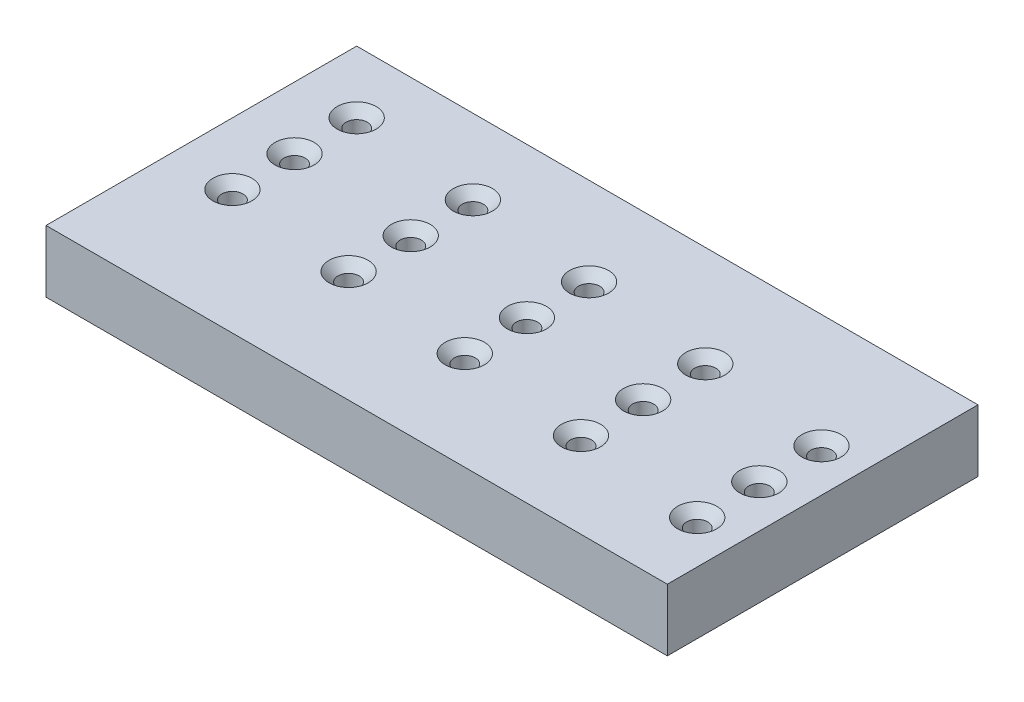
ISO-10303-21;
HEADER;
FILE_DESCRIPTION(('STEP AP214'),'2;1');
FILE_NAME('part.step','',(''),(''),'','','');
FILE_SCHEMA(('AUTOMOTIVE_DESIGN { 1 0 10303 214 1 1 1 1 }'));
ENDSEC;
DATA;
#1=APPLICATION_CONTEXT('core data for automotive mechanical design processes');
#2=APPLICATION_PROTOCOL_DEFINITION('international standard','automotive_design',2000,#1);
#3=PRODUCT_CONTEXT('',#1,'mechanical');
#4=PRODUCT('Part','Part','',(#3));
#5=PRODUCT_RELATED_PRODUCT_CATEGORY('part','',(#4));
#6=PRODUCT_DEFINITION_FORMATION('','',#4);
#7=PRODUCT_DEFINITION_CONTEXT('part definition',#1,'design');
#8=PRODUCT_DEFINITION('design','',#6,#7);
#9=PRODUCT_DEFINITION_SHAPE('','',#8);
#10=(LENGTH_UNIT() NAMED_UNIT(*) SI_UNIT(.MILLI.,.METRE.));
#11=(NAMED_UNIT(*) PLANE_ANGLE_UNIT() SI_UNIT($,.RADIAN.));
#12=(NAMED_UNIT(*) SI_UNIT($,.STERADIAN.) SOLID_ANGLE_UNIT());
#13=UNCERTAINTY_MEASURE_WITH_UNIT(LENGTH_MEASURE(1.E-05),#10,'distance_accuracy_value','');
#14=(GEOMETRIC_REPRESENTATION_CONTEXT(3) GLOBAL_UNCERTAINTY_ASSIGNED_CONTEXT((#13)) GLOBAL_UNIT_ASSIGNED_CONTEXT((#10,
#11,#12)) REPRESENTATION_CONTEXT('',''));
#15=CARTESIAN_POINT('',(0.,0.,0.));
#16=DIRECTION('',(0.,0.,1.));
#17=DIRECTION('',(1.,0.,0.));
#18=AXIS2_PLACEMENT_3D('',#15,#16,#17);
#19=CARTESIAN_POINT('',(-50.,10.,-25.));
#20=DIRECTION('',(1.,0.,0.));
#21=DIRECTION('',(0.,0.,-1.));
#22=AXIS2_PLACEMENT_3D('',#19,#20,#21);
#23=PLANE('',#22);
#24=DIRECTION('',(0.,0.,1.));
#25=VECTOR('',#24,1.);
#26=CARTESIAN_POINT('',(-50.,0.,-25.));
#27=LINE('',#26,#25);
#28=CARTESIAN_POINT('',(-50.,0.,-25.));
#29=VERTEX_POINT('',#28);
#30=CARTESIAN_POINT('',(-50.,0.,25.));
#31=VERTEX_POINT('',#30);
#32=EDGE_CURVE('E96',#29,#31,#27,.T.);
#33=ORIENTED_EDGE('',*,*,#32,.T.);
#34=DIRECTION('',(0.,-1.,0.));
#35=VECTOR('',#34,1.);
#36=CARTESIAN_POINT('',(-50.,10.,25.));
#37=LINE('',#36,#35);
#38=CARTESIAN_POINT('',(-50.,10.,25.));
#39=VERTEX_POINT('',#38);
#40=EDGE_CURVE('E11',#39,#31,#37,.T.);
#41=ORIENTED_EDGE('',*,*,#40,.F.);
#42=DIRECTION('',(0.,0.,1.));
#43=VECTOR('',#42,1.);
#44=CARTESIAN_POINT('',(-50.,10.,-25.));
#45=LINE('',#44,#43);
#46=CARTESIAN_POINT('',(-50.,10.,-25.));
#47=VERTEX_POINT('',#46);
#48=EDGE_CURVE('E84',#47,#39,#45,.T.);
#49=ORIENTED_EDGE('',*,*,#48,.F.);
#50=DIRECTION('',(0.,-1.,0.));
#51=VECTOR('',#50,1.);
#52=CARTESIAN_POINT('',(-50.,10.,-25.));
#53=LINE('',#52,#51);
#54=EDGE_CURVE('E92',#47,#29,#53,.T.);
#55=ORIENTED_EDGE('',*,*,#54,.T.);
#56=EDGE_LOOP('',(#33,#41,#49,#55));
#57=FACE_BOUND('',#56,.T.);
#58=ADVANCED_FACE('F33',(#57),#23,.F.);
#59=CARTESIAN_POINT('',(-50.,10.,25.));
#60=DIRECTION('',(0.,0.,-1.));
#61=DIRECTION('',(-1.,0.,0.));
#62=AXIS2_PLACEMENT_3D('',#59,#60,#61);
#63=PLANE('',#62);
#64=DIRECTION('',(1.,0.,0.));
#65=VECTOR('',#64,1.);
#66=CARTESIAN_POINT('',(-50.,0.,25.));
#67=LINE('',#66,#65);
#68=CARTESIAN_POINT('',(50.,0.,25.));
#69=VERTEX_POINT('',#68);
#70=EDGE_CURVE('E88',#31,#69,#67,.T.);
#71=ORIENTED_EDGE('',*,*,#70,.T.);
#72=DIRECTION('',(0.,-1.,0.));
#73=VECTOR('',#72,1.);
#74=CARTESIAN_POINT('',(50.,10.,25.));
#75=LINE('',#74,#73);
#76=CARTESIAN_POINT('',(50.,10.,25.));
#77=VERTEX_POINT('',#76);
#78=EDGE_CURVE('E41',#77,#69,#75,.T.);
#79=ORIENTED_EDGE('',*,*,#78,.F.);
#80=DIRECTION('',(1.,0.,0.));
#81=VECTOR('',#80,1.);
#82=CARTESIAN_POINT('',(-50.,10.,25.));
#83=LINE('',#82,#81);
#84=EDGE_CURVE('E79',#39,#77,#83,.T.);
#85=ORIENTED_EDGE('',*,*,#84,.F.);
#86=ORIENTED_EDGE('',*,*,#40,.T.);
#87=EDGE_LOOP('',(#71,#79,#85,#86));
#88=FACE_BOUND('',#87,.T.);
#89=ADVANCED_FACE('F87',(#88),#63,.F.);
#90=CARTESIAN_POINT('',(50.,10.,-25.));
#91=DIRECTION('',(-1.,0.,0.));
#92=DIRECTION('',(0.,0.,1.));
#93=AXIS2_PLACEMENT_3D('',#90,#91,#92);
#94=PLANE('',#93);
#95=DIRECTION('',(0.,0.,-1.));
#96=VECTOR('',#95,1.);
#97=CARTESIAN_POINT('',(50.,0.,-25.));
#98=LINE('',#97,#96);
#99=CARTESIAN_POINT('',(50.,0.,-25.));
#100=VERTEX_POINT('',#99);
#101=EDGE_CURVE('E66',#69,#100,#98,.T.);
#102=ORIENTED_EDGE('',*,*,#101,.T.);
#103=DIRECTION('',(0.,-1.,0.));
#104=VECTOR('',#103,1.);
#105=CARTESIAN_POINT('',(50.,10.,-25.));
#106=LINE('',#105,#104);
#107=CARTESIAN_POINT('',(50.,10.,-25.));
#108=VERTEX_POINT('',#107);
#109=EDGE_CURVE('E89',#108,#100,#106,.T.);
#110=ORIENTED_EDGE('',*,*,#109,.F.);
#111=DIRECTION('',(0.,0.,-1.));
#112=VECTOR('',#111,1.);
#113=CARTESIAN_POINT('',(50.,10.,-25.));
#114=LINE('',#113,#112);
#115=EDGE_CURVE('E82',#77,#108,#114,.T.);
#116=ORIENTED_EDGE('',*,*,#115,.F.);
#117=ORIENTED_EDGE('',*,*,#78,.T.);
#118=EDGE_LOOP('',(#102,#110,#116,#117));
#119=FACE_BOUND('',#118,.T.);
#120=ADVANCED_FACE('F90',(#119),#94,.F.);
#121=CARTESIAN_POINT('',(-50.,10.,-25.));
#122=DIRECTION('',(0.,0.,1.));
#123=DIRECTION('',(1.,0.,0.));
#124=AXIS2_PLACEMENT_3D('',#121,#122,#123);
#125=PLANE('',#124);
#126=DIRECTION('',(-1.,0.,0.));
#127=VECTOR('',#126,1.);
#128=CARTESIAN_POINT('',(-50.,0.,-25.));
#129=LINE('',#128,#127);
#130=EDGE_CURVE('E72',#100,#29,#129,.T.);
#131=ORIENTED_EDGE('',*,*,#130,.T.);
#132=ORIENTED_EDGE('',*,*,#54,.F.);
#133=DIRECTION('',(-1.,0.,0.));
#134=VECTOR('',#133,1.);
#135=CARTESIAN_POINT('',(-50.,10.,-25.));
#136=LINE('',#135,#134);
#137=EDGE_CURVE('E49',#108,#47,#136,.T.);
#138=ORIENTED_EDGE('',*,*,#137,.F.);
#139=ORIENTED_EDGE('',*,*,#109,.T.);
#140=EDGE_LOOP('',(#131,#132,#138,#139));
#141=FACE_BOUND('',#140,.T.);
#142=ADVANCED_FACE('F104',(#141),#125,.F.);
#143=CARTESIAN_POINT('',(0.,10.,0.));
#144=DIRECTION('',(0.,1.,0.));
#145=DIRECTION('',(0.,0.,1.));
#146=AXIS2_PLACEMENT_3D('',#143,#144,#145);
#147=PLANE('',#146);
#148=CARTESIAN_POINT('',(43.1189350285932,10.,13.3118935028593));
#149=DIRECTION('',(0.,1.,0.));
#150=DIRECTION('',(0.,0.,1.));
#151=AXIS2_PLACEMENT_3D('',#148,#149,#150);
#152=CIRCLE('',#151,3.15);
#153=CARTESIAN_POINT('',(43.1189350285932,10.,16.4618935028593));
#154=VERTEX_POINT('',#153);
#155=EDGE_CURVE('E241',#154,#154,#152,.T.);
#156=ORIENTED_EDGE('',*,*,#155,.F.);
#157=EDGE_LOOP('',(#156));
#158=FACE_BOUND('',#157,.T.);
#159=CARTESIAN_POINT('',(43.1189350285932,10.,3.31189350285933));
#160=DIRECTION('',(0.,1.,0.));
#161=DIRECTION('',(0.,0.,1.));
#162=AXIS2_PLACEMENT_3D('',#159,#160,#161);
#163=CIRCLE('',#162,3.15);
#164=CARTESIAN_POINT('',(43.1189350285932,10.,6.46189350285933));
#165=VERTEX_POINT('',#164);
#166=EDGE_CURVE('E232',#165,#165,#163,.T.);
#167=ORIENTED_EDGE('',*,*,#166,.F.);
#168=EDGE_LOOP('',(#167));
#169=FACE_BOUND('',#168,.T.);
#170=CARTESIAN_POINT('',(43.1189350285932,10.,-6.68810649714067));
#171=DIRECTION('',(0.,1.,0.));
#172=DIRECTION('',(0.,0.,1.));
#173=AXIS2_PLACEMENT_3D('',#170,#171,#172);
#174=CIRCLE('',#173,3.15);
#175=CARTESIAN_POINT('',(43.1189350285932,10.,-3.53810649714067));
#176=VERTEX_POINT('',#175);
#177=EDGE_CURVE('E223',#176,#176,#174,.T.);
#178=ORIENTED_EDGE('',*,*,#177,.F.);
#179=EDGE_LOOP('',(#178));
#180=FACE_BOUND('',#179,.T.);
#181=CARTESIAN_POINT('',(22.3392012714449,10.,11.2339201271445));
#182=DIRECTION('',(0.,1.,0.));
#183=DIRECTION('',(0.,0.,1.));
#184=AXIS2_PLACEMENT_3D('',#181,#182,#183);
#185=CIRCLE('',#184,3.15);
#186=CARTESIAN_POINT('',(22.3392012714449,10.,14.3839201271445));
#187=VERTEX_POINT('',#186);
#188=EDGE_CURVE('E214',#187,#187,#185,.T.);
#189=ORIENTED_EDGE('',*,*,#188,.F.);
#190=EDGE_LOOP('',(#189));
#191=FACE_BOUND('',#190,.T.);
#192=CARTESIAN_POINT('',(22.3392012714449,10.,1.2339201271445));
#193=DIRECTION('',(0.,1.,0.));
#194=DIRECTION('',(0.,0.,1.));
#195=AXIS2_PLACEMENT_3D('',#192,#193,#194);
#196=CIRCLE('',#195,3.15);
#197=CARTESIAN_POINT('',(22.3392012714449,10.,4.3839201271445));
#198=VERTEX_POINT('',#197);
#199=EDGE_CURVE('E205',#198,#198,#196,.T.);
#200=ORIENTED_EDGE('',*,*,#199,.F.);
#201=EDGE_LOOP('',(#200));
#202=FACE_BOUND('',#201,.T.);
#203=CARTESIAN_POINT('',(22.3392012714449,10.,-8.7660798728555));
#204=DIRECTION('',(0.,1.,0.));
#205=DIRECTION('',(0.,0.,1.));
#206=AXIS2_PLACEMENT_3D('',#203,#204,#205);
#207=CIRCLE('',#206,3.15);
#208=CARTESIAN_POINT('',(22.3392012714449,10.,-5.6160798728555));
#209=VERTEX_POINT('',#208);
#210=EDGE_CURVE('E196',#209,#209,#207,.T.);
#211=ORIENTED_EDGE('',*,*,#210,.F.);
#212=EDGE_LOOP('',(#211));
#213=FACE_BOUND('',#212,.T.);
#214=CARTESIAN_POINT('',(1.55946751429659,10.,9.15594675142967));
#215=DIRECTION('',(0.,1.,0.));
#216=DIRECTION('',(0.,0.,1.));
#217=AXIS2_PLACEMENT_3D('',#214,#215,#216);
#218=CIRCLE('',#217,3.15);
#219=CARTESIAN_POINT('',(1.55946751429659,10.,12.3059467514297));
#220=VERTEX_POINT('',#219);
#221=EDGE_CURVE('E187',#220,#220,#218,.T.);
#222=ORIENTED_EDGE('',*,*,#221,.F.);
#223=EDGE_LOOP('',(#222));
#224=FACE_BOUND('',#223,.T.);
#225=CARTESIAN_POINT('',(1.55946751429659,10.,-0.844053248570335));
#226=DIRECTION('',(0.,1.,0.));
#227=DIRECTION('',(0.,0.,1.));
#228=AXIS2_PLACEMENT_3D('',#225,#226,#227);
#229=CIRCLE('',#228,3.15);
#230=CARTESIAN_POINT('',(1.55946751429659,10.,2.30594675142966));
#231=VERTEX_POINT('',#230);
#232=EDGE_CURVE('E178',#231,#231,#229,.T.);
#233=ORIENTED_EDGE('',*,*,#232,.F.);
#234=EDGE_LOOP('',(#233));
#235=FACE_BOUND('',#234,.T.);
#236=CARTESIAN_POINT('',(1.55946751429659,10.,-10.8440532485703));
#237=DIRECTION('',(0.,1.,0.));
#238=DIRECTION('',(0.,0.,1.));
#239=AXIS2_PLACEMENT_3D('',#236,#237,#238);
#240=CIRCLE('',#239,3.15);
#241=CARTESIAN_POINT('',(1.55946751429659,10.,-7.69405324857033));
#242=VERTEX_POINT('',#241);
#243=EDGE_CURVE('E169',#242,#242,#240,.T.);
#244=ORIENTED_EDGE('',*,*,#243,.F.);
#245=EDGE_LOOP('',(#244));
#246=FACE_BOUND('',#245,.T.);
#247=CARTESIAN_POINT('',(-19.2202662428517,10.,7.07797337571484));
#248=DIRECTION('',(0.,1.,0.));
#249=DIRECTION('',(0.,0.,1.));
#250=AXIS2_PLACEMENT_3D('',#247,#248,#249);
#251=CIRCLE('',#250,3.15);
#252=CARTESIAN_POINT('',(-19.2202662428517,10.,10.2279733757148));
#253=VERTEX_POINT('',#252);
#254=EDGE_CURVE('E160',#253,#253,#251,.T.);
#255=ORIENTED_EDGE('',*,*,#254,.F.);
#256=EDGE_LOOP('',(#255));
#257=FACE_BOUND('',#256,.T.);
#258=CARTESIAN_POINT('',(-19.2202662428517,10.,-2.92202662428516));
#259=DIRECTION('',(0.,1.,0.));
#260=DIRECTION('',(0.,0.,1.));
#261=AXIS2_PLACEMENT_3D('',#258,#259,#260);
#262=CIRCLE('',#261,3.15);
#263=CARTESIAN_POINT('',(-19.2202662428517,10.,0.227973375714835));
#264=VERTEX_POINT('',#263);
#265=EDGE_CURVE('E151',#264,#264,#262,.T.);
#266=ORIENTED_EDGE('',*,*,#265,.F.);
#267=EDGE_LOOP('',(#266));
#268=FACE_BOUND('',#267,.T.);
#269=CARTESIAN_POINT('',(-19.2202662428517,10.,-12.9220266242852));
#270=DIRECTION('',(0.,1.,0.));
#271=DIRECTION('',(0.,0.,1.));
#272=AXIS2_PLACEMENT_3D('',#269,#270,#271);
#273=CIRCLE('',#272,3.15);
#274=CARTESIAN_POINT('',(-19.2202662428517,10.,-9.77202662428516));
#275=VERTEX_POINT('',#274);
#276=EDGE_CURVE('E142',#275,#275,#273,.T.);
#277=ORIENTED_EDGE('',*,*,#276,.F.);
#278=EDGE_LOOP('',(#277));
#279=FACE_BOUND('',#278,.T.);
#280=CARTESIAN_POINT('',(-40.,10.,5.));
#281=DIRECTION('',(0.,1.,0.));
#282=DIRECTION('',(0.,0.,1.));
#283=AXIS2_PLACEMENT_3D('',#280,#281,#282);
#284=CIRCLE('',#283,3.15);
#285=CARTESIAN_POINT('',(-40.,10.,8.15));
#286=VERTEX_POINT('',#285);
#287=EDGE_CURVE('E133',#286,#286,#284,.T.);
#288=ORIENTED_EDGE('',*,*,#287,.F.);
#289=EDGE_LOOP('',(#288));
#290=FACE_BOUND('',#289,.T.);
#291=CARTESIAN_POINT('',(-40.,10.,-5.));
#292=DIRECTION('',(0.,1.,0.));
#293=DIRECTION('',(0.,0.,1.));
#294=AXIS2_PLACEMENT_3D('',#291,#292,#293);
#295=CIRCLE('',#294,3.15);
#296=CARTESIAN_POINT('',(-40.,10.,-1.85));
#297=VERTEX_POINT('',#296);
#298=EDGE_CURVE('E124',#297,#297,#295,.T.);
#299=ORIENTED_EDGE('',*,*,#298,.F.);
#300=EDGE_LOOP('',(#299));
#301=FACE_BOUND('',#300,.T.);
#302=CARTESIAN_POINT('',(-40.,10.,-15.));
#303=DIRECTION('',(0.,1.,0.));
#304=DIRECTION('',(0.,0.,1.));
#305=AXIS2_PLACEMENT_3D('',#302,#303,#304);
#306=CIRCLE('',#305,3.15);
#307=CARTESIAN_POINT('',(-40.,10.,-11.85));
#308=VERTEX_POINT('',#307);
#309=EDGE_CURVE('E115',#308,#308,#306,.T.);
#310=ORIENTED_EDGE('',*,*,#309,.F.);
#311=EDGE_LOOP('',(#310));
#312=FACE_BOUND('',#311,.T.);
#313=ORIENTED_EDGE('',*,*,#48,.T.);
#314=ORIENTED_EDGE('',*,*,#84,.T.);
#315=ORIENTED_EDGE('',*,*,#115,.T.);
#316=ORIENTED_EDGE('',*,*,#137,.T.);
#317=EDGE_LOOP('',(#313,#314,#315,#316));
#318=FACE_BOUND('',#317,.T.);
#319=ADVANCED_FACE('F80',(#158,#169,#180,#191,#202,#213,#224,#235,#246,#257,#268,#279,#290,#301,
#312,#318),#147,.T.);
#320=CARTESIAN_POINT('',(0.,0.,0.));
#321=DIRECTION('',(0.,1.,0.));
#322=DIRECTION('',(0.,0.,1.));
#323=AXIS2_PLACEMENT_3D('',#320,#321,#322);
#324=PLANE('',#323);
#325=CARTESIAN_POINT('',(43.1189350285932,0.,13.3118935028593));
#326=DIRECTION('',(0.,1.,0.));
#327=DIRECTION('',(0.,0.,1.));
#328=AXIS2_PLACEMENT_3D('',#325,#326,#327);
#329=CIRCLE('',#328,1.7);
#330=CARTESIAN_POINT('',(43.1189350285932,0.,15.0118935028593));
#331=VERTEX_POINT('',#330);
#332=EDGE_CURVE('E235',#331,#331,#329,.T.);
#333=ORIENTED_EDGE('',*,*,#332,.T.);
#334=EDGE_LOOP('',(#333));
#335=FACE_BOUND('',#334,.T.);
#336=CARTESIAN_POINT('',(43.1189350285932,0.,3.31189350285933));
#337=DIRECTION('',(0.,1.,0.));
#338=DIRECTION('',(0.,0.,1.));
#339=AXIS2_PLACEMENT_3D('',#336,#337,#338);
#340=CIRCLE('',#339,1.7);
#341=CARTESIAN_POINT('',(43.1189350285932,0.,5.01189350285933));
#342=VERTEX_POINT('',#341);
#343=EDGE_CURVE('E226',#342,#342,#340,.T.);
#344=ORIENTED_EDGE('',*,*,#343,.T.);
#345=EDGE_LOOP('',(#344));
#346=FACE_BOUND('',#345,.T.);
#347=CARTESIAN_POINT('',(43.1189350285932,0.,-6.68810649714067));
#348=DIRECTION('',(0.,1.,0.));
#349=DIRECTION('',(0.,0.,1.));
#350=AXIS2_PLACEMENT_3D('',#347,#348,#349);
#351=CIRCLE('',#350,1.7);
#352=CARTESIAN_POINT('',(43.1189350285932,0.,-4.98810649714067));
#353=VERTEX_POINT('',#352);
#354=EDGE_CURVE('E217',#353,#353,#351,.T.);
#355=ORIENTED_EDGE('',*,*,#354,.T.);
#356=EDGE_LOOP('',(#355));
#357=FACE_BOUND('',#356,.T.);
#358=CARTESIAN_POINT('',(22.3392012714449,0.,11.2339201271445));
#359=DIRECTION('',(0.,1.,0.));
#360=DIRECTION('',(0.,0.,1.));
#361=AXIS2_PLACEMENT_3D('',#358,#359,#360);
#362=CIRCLE('',#361,1.7);
#363=CARTESIAN_POINT('',(22.3392012714449,0.,12.9339201271445));
#364=VERTEX_POINT('',#363);
#365=EDGE_CURVE('E208',#364,#364,#362,.T.);
#366=ORIENTED_EDGE('',*,*,#365,.T.);
#367=EDGE_LOOP('',(#366));
#368=FACE_BOUND('',#367,.T.);
#369=CARTESIAN_POINT('',(22.3392012714449,0.,1.2339201271445));
#370=DIRECTION('',(0.,1.,0.));
#371=DIRECTION('',(0.,0.,1.));
#372=AXIS2_PLACEMENT_3D('',#369,#370,#371);
#373=CIRCLE('',#372,1.7);
#374=CARTESIAN_POINT('',(22.3392012714449,0.,2.93392012714449));
#375=VERTEX_POINT('',#374);
#376=EDGE_CURVE('E199',#375,#375,#373,.T.);
#377=ORIENTED_EDGE('',*,*,#376,.T.);
#378=EDGE_LOOP('',(#377));
#379=FACE_BOUND('',#378,.T.);
#380=CARTESIAN_POINT('',(22.3392012714449,0.,-8.7660798728555));
#381=DIRECTION('',(0.,1.,0.));
#382=DIRECTION('',(0.,0.,1.));
#383=AXIS2_PLACEMENT_3D('',#380,#381,#382);
#384=CIRCLE('',#383,1.7);
#385=CARTESIAN_POINT('',(22.3392012714449,0.,-7.06607987285551));
#386=VERTEX_POINT('',#385);
#387=EDGE_CURVE('E190',#386,#386,#384,.T.);
#388=ORIENTED_EDGE('',*,*,#387,.T.);
#389=EDGE_LOOP('',(#388));
#390=FACE_BOUND('',#389,.T.);
#391=CARTESIAN_POINT('',(1.55946751429659,0.,9.15594675142967));
#392=DIRECTION('',(0.,1.,0.));
#393=DIRECTION('',(0.,0.,1.));
#394=AXIS2_PLACEMENT_3D('',#391,#392,#393);
#395=CIRCLE('',#394,1.7);
#396=CARTESIAN_POINT('',(1.55946751429659,0.,10.8559467514297));
#397=VERTEX_POINT('',#396);
#398=EDGE_CURVE('E181',#397,#397,#395,.T.);
#399=ORIENTED_EDGE('',*,*,#398,.T.);
#400=EDGE_LOOP('',(#399));
#401=FACE_BOUND('',#400,.T.);
#402=CARTESIAN_POINT('',(1.55946751429659,0.,-0.844053248570335));
#403=DIRECTION('',(0.,1.,0.));
#404=DIRECTION('',(0.,0.,1.));
#405=AXIS2_PLACEMENT_3D('',#402,#403,#404);
#406=CIRCLE('',#405,1.7);
#407=CARTESIAN_POINT('',(1.55946751429659,0.,0.855946751429662));
#408=VERTEX_POINT('',#407);
#409=EDGE_CURVE('E172',#408,#408,#406,.T.);
#410=ORIENTED_EDGE('',*,*,#409,.T.);
#411=EDGE_LOOP('',(#410));
#412=FACE_BOUND('',#411,.T.);
#413=CARTESIAN_POINT('',(1.55946751429659,0.,-10.8440532485703));
#414=DIRECTION('',(0.,1.,0.));
#415=DIRECTION('',(0.,0.,1.));
#416=AXIS2_PLACEMENT_3D('',#413,#414,#415);
#417=CIRCLE('',#416,1.7);
#418=CARTESIAN_POINT('',(1.55946751429659,0.,-9.14405324857034));
#419=VERTEX_POINT('',#418);
#420=EDGE_CURVE('E163',#419,#419,#417,.T.);
#421=ORIENTED_EDGE('',*,*,#420,.T.);
#422=EDGE_LOOP('',(#421));
#423=FACE_BOUND('',#422,.T.);
#424=CARTESIAN_POINT('',(-19.2202662428517,0.,7.07797337571484));
#425=DIRECTION('',(0.,1.,0.));
#426=DIRECTION('',(0.,0.,1.));
#427=AXIS2_PLACEMENT_3D('',#424,#425,#426);
#428=CIRCLE('',#427,1.7);
#429=CARTESIAN_POINT('',(-19.2202662428517,0.,8.77797337571483));
#430=VERTEX_POINT('',#429);
#431=EDGE_CURVE('E154',#430,#430,#428,.T.);
#432=ORIENTED_EDGE('',*,*,#431,.T.);
#433=EDGE_LOOP('',(#432));
#434=FACE_BOUND('',#433,.T.);
#435=CARTESIAN_POINT('',(-19.2202662428517,0.,-2.92202662428516));
#436=DIRECTION('',(0.,1.,0.));
#437=DIRECTION('',(0.,0.,1.));
#438=AXIS2_PLACEMENT_3D('',#435,#436,#437);
#439=CIRCLE('',#438,1.7);
#440=CARTESIAN_POINT('',(-19.2202662428517,0.,-1.22202662428517));
#441=VERTEX_POINT('',#440);
#442=EDGE_CURVE('E145',#441,#441,#439,.T.);
#443=ORIENTED_EDGE('',*,*,#442,.T.);
#444=EDGE_LOOP('',(#443));
#445=FACE_BOUND('',#444,.T.);
#446=CARTESIAN_POINT('',(-19.2202662428517,0.,-12.9220266242852));
#447=DIRECTION('',(0.,1.,0.));
#448=DIRECTION('',(0.,0.,1.));
#449=AXIS2_PLACEMENT_3D('',#446,#447,#448);
#450=CIRCLE('',#449,1.7);
#451=CARTESIAN_POINT('',(-19.2202662428517,0.,-11.2220266242852));
#452=VERTEX_POINT('',#451);
#453=EDGE_CURVE('E136',#452,#452,#450,.T.);
#454=ORIENTED_EDGE('',*,*,#453,.T.);
#455=EDGE_LOOP('',(#454));
#456=FACE_BOUND('',#455,.T.);
#457=CARTESIAN_POINT('',(-40.,0.,5.));
#458=DIRECTION('',(0.,1.,0.));
#459=DIRECTION('',(0.,0.,1.));
#460=AXIS2_PLACEMENT_3D('',#457,#458,#459);
#461=CIRCLE('',#460,1.7);
#462=CARTESIAN_POINT('',(-40.,0.,6.7));
#463=VERTEX_POINT('',#462);
#464=EDGE_CURVE('E127',#463,#463,#461,.T.);
#465=ORIENTED_EDGE('',*,*,#464,.T.);
#466=EDGE_LOOP('',(#465));
#467=FACE_BOUND('',#466,.T.);
#468=CARTESIAN_POINT('',(-40.,0.,-5.));
#469=DIRECTION('',(0.,1.,0.));
#470=DIRECTION('',(0.,0.,1.));
#471=AXIS2_PLACEMENT_3D('',#468,#469,#470);
#472=CIRCLE('',#471,1.7);
#473=CARTESIAN_POINT('',(-40.,0.,-3.3));
#474=VERTEX_POINT('',#473);
#475=EDGE_CURVE('E118',#474,#474,#472,.T.);
#476=ORIENTED_EDGE('',*,*,#475,.T.);
#477=EDGE_LOOP('',(#476));
#478=FACE_BOUND('',#477,.T.);
#479=CARTESIAN_POINT('',(-40.,0.,-15.));
#480=DIRECTION('',(0.,1.,0.));
#481=DIRECTION('',(0.,0.,1.));
#482=AXIS2_PLACEMENT_3D('',#479,#480,#481);
#483=CIRCLE('',#482,1.7);
#484=CARTESIAN_POINT('',(-40.,0.,-13.3));
#485=VERTEX_POINT('',#484);
#486=EDGE_CURVE('E99',#485,#485,#483,.T.);
#487=ORIENTED_EDGE('',*,*,#486,.T.);
#488=EDGE_LOOP('',(#487));
#489=FACE_BOUND('',#488,.T.);
#490=ORIENTED_EDGE('',*,*,#32,.F.);
#491=ORIENTED_EDGE('',*,*,#130,.F.);
#492=ORIENTED_EDGE('',*,*,#101,.F.);
#493=ORIENTED_EDGE('',*,*,#70,.F.);
#494=EDGE_LOOP('',(#490,#491,#492,#493));
#495=FACE_BOUND('',#494,.T.);
#496=ADVANCED_FACE('F107',(#335,#346,#357,#368,#379,#390,#401,#412,#423,#434,#445,#456,#467,
#478,#489,#495),#324,.F.);
#497=CARTESIAN_POINT('',(-40.,10.,-15.));
#498=DIRECTION('',(0.,1.,0.));
#499=DIRECTION('',(0.,0.,1.));
#500=AXIS2_PLACEMENT_3D('',#497,#498,#499);
#501=CYLINDRICAL_SURFACE('',#500,1.7);
#502=ORIENTED_EDGE('',*,*,#486,.F.);
#503=EDGE_LOOP('',(#502));
#504=FACE_BOUND('',#503,.T.);
#505=CARTESIAN_POINT('',(-40.,8.55,-15.));
#506=DIRECTION('',(0.,1.,0.));
#507=DIRECTION('',(0.,0.,1.));
#508=AXIS2_PLACEMENT_3D('',#505,#506,#507);
#509=CIRCLE('',#508,1.7);
#510=CARTESIAN_POINT('',(-40.,8.55,-13.3));
#511=VERTEX_POINT('',#510);
#512=EDGE_CURVE('E112',#511,#511,#509,.T.);
#513=ORIENTED_EDGE('',*,*,#512,.T.);
#514=EDGE_LOOP('',(#513));
#515=FACE_BOUND('',#514,.T.);
#516=ADVANCED_FACE('F281',(#504,#515),#501,.F.);
#517=CARTESIAN_POINT('',(-40.,10.,-15.));
#518=DIRECTION('',(0.,1.,0.));
#519=DIRECTION('',(0.,0.,1.));
#520=AXIS2_PLACEMENT_3D('',#517,#518,#519);
#521=CONICAL_SURFACE('',#520,3.15,0.785398163397448);
#522=ORIENTED_EDGE('',*,*,#512,.F.);
#523=EDGE_LOOP('',(#522));
#524=FACE_BOUND('',#523,.T.);
#525=ORIENTED_EDGE('',*,*,#309,.T.);
#526=EDGE_LOOP('',(#525));
#527=FACE_BOUND('',#526,.T.);
#528=ADVANCED_FACE('F278',(#524,#527),#521,.F.);
#529=CARTESIAN_POINT('',(-40.,10.,-5.));
#530=DIRECTION('',(0.,1.,0.));
#531=DIRECTION('',(0.,0.,1.));
#532=AXIS2_PLACEMENT_3D('',#529,#530,#531);
#533=CYLINDRICAL_SURFACE('',#532,1.7);
#534=ORIENTED_EDGE('',*,*,#475,.F.);
#535=EDGE_LOOP('',(#534));
#536=FACE_BOUND('',#535,.T.);
#537=CARTESIAN_POINT('',(-40.,8.55,-5.));
#538=DIRECTION('',(0.,1.,0.));
#539=DIRECTION('',(0.,0.,1.));
#540=AXIS2_PLACEMENT_3D('',#537,#538,#539);
#541=CIRCLE('',#540,1.7);
#542=CARTESIAN_POINT('',(-40.,8.55,-3.3));
#543=VERTEX_POINT('',#542);
#544=EDGE_CURVE('E121',#543,#543,#541,.T.);
#545=ORIENTED_EDGE('',*,*,#544,.T.);
#546=EDGE_LOOP('',(#545));
#547=FACE_BOUND('',#546,.T.);
#548=ADVANCED_FACE('F280',(#536,#547),#533,.F.);
#549=CARTESIAN_POINT('',(-40.,10.,-5.));
#550=DIRECTION('',(0.,1.,0.));
#551=DIRECTION('',(0.,0.,1.));
#552=AXIS2_PLACEMENT_3D('',#549,#550,#551);
#553=CONICAL_SURFACE('',#552,3.15,0.785398163397448);
#554=ORIENTED_EDGE('',*,*,#544,.F.);
#555=EDGE_LOOP('',(#554));
#556=FACE_BOUND('',#555,.T.);
#557=ORIENTED_EDGE('',*,*,#298,.T.);
#558=EDGE_LOOP('',(#557));
#559=FACE_BOUND('',#558,.T.);
#560=ADVANCED_FACE('F288',(#556,#559),#553,.F.);
#561=CARTESIAN_POINT('',(-40.,10.,5.));
#562=DIRECTION('',(0.,1.,0.));
#563=DIRECTION('',(0.,0.,1.));
#564=AXIS2_PLACEMENT_3D('',#561,#562,#563);
#565=CYLINDRICAL_SURFACE('',#564,1.7);
#566=ORIENTED_EDGE('',*,*,#464,.F.);
#567=EDGE_LOOP('',(#566));
#568=FACE_BOUND('',#567,.T.);
#569=CARTESIAN_POINT('',(-40.,8.55,5.));
#570=DIRECTION('',(0.,1.,0.));
#571=DIRECTION('',(0.,0.,1.));
#572=AXIS2_PLACEMENT_3D('',#569,#570,#571);
#573=CIRCLE('',#572,1.7);
#574=CARTESIAN_POINT('',(-40.,8.55,6.7));
#575=VERTEX_POINT('',#574);
#576=EDGE_CURVE('E130',#575,#575,#573,.T.);
#577=ORIENTED_EDGE('',*,*,#576,.T.);
#578=EDGE_LOOP('',(#577));
#579=FACE_BOUND('',#578,.T.);
#580=ADVANCED_FACE('F344',(#568,#579),#565,.F.);
#581=CARTESIAN_POINT('',(-40.,10.,5.));
#582=DIRECTION('',(0.,1.,0.));
#583=DIRECTION('',(0.,0.,1.));
#584=AXIS2_PLACEMENT_3D('',#581,#582,#583);
#585=CONICAL_SURFACE('',#584,3.15,0.785398163397448);
#586=ORIENTED_EDGE('',*,*,#576,.F.);
#587=EDGE_LOOP('',(#586));
#588=FACE_BOUND('',#587,.T.);
#589=ORIENTED_EDGE('',*,*,#287,.T.);
#590=EDGE_LOOP('',(#589));
#591=FACE_BOUND('',#590,.T.);
#592=ADVANCED_FACE('F349',(#588,#591),#585,.F.);
#593=CARTESIAN_POINT('',(-19.2202662428517,10.,-12.9220266242852));
#594=DIRECTION('',(0.,1.,0.));
#595=DIRECTION('',(0.,0.,1.));
#596=AXIS2_PLACEMENT_3D('',#593,#594,#595);
#597=CYLINDRICAL_SURFACE('',#596,1.7);
#598=ORIENTED_EDGE('',*,*,#453,.F.);
#599=EDGE_LOOP('',(#598));
#600=FACE_BOUND('',#599,.T.);
#601=CARTESIAN_POINT('',(-19.2202662428517,8.55,-12.9220266242852));
#602=DIRECTION('',(0.,1.,0.));
#603=DIRECTION('',(0.,0.,1.));
#604=AXIS2_PLACEMENT_3D('',#601,#602,#603);
#605=CIRCLE('',#604,1.7);
#606=CARTESIAN_POINT('',(-19.2202662428517,8.55,-11.2220266242852));
#607=VERTEX_POINT('',#606);
#608=EDGE_CURVE('E139',#607,#607,#605,.T.);
#609=ORIENTED_EDGE('',*,*,#608,.T.);
#610=EDGE_LOOP('',(#609));
#611=FACE_BOUND('',#610,.T.);
#612=ADVANCED_FACE('F355',(#600,#611),#597,.F.);
#613=CARTESIAN_POINT('',(-19.2202662428517,10.,-12.9220266242852));
#614=DIRECTION('',(0.,1.,0.));
#615=DIRECTION('',(0.,0.,1.));
#616=AXIS2_PLACEMENT_3D('',#613,#614,#615);
#617=CONICAL_SURFACE('',#616,3.15,0.785398163397449);
#618=ORIENTED_EDGE('',*,*,#608,.F.);
#619=EDGE_LOOP('',(#618));
#620=FACE_BOUND('',#619,.T.);
#621=ORIENTED_EDGE('',*,*,#276,.T.);
#622=EDGE_LOOP('',(#621));
#623=FACE_BOUND('',#622,.T.);
#624=ADVANCED_FACE('F359',(#620,#623),#617,.F.);
#625=CARTESIAN_POINT('',(-19.2202662428517,10.,-2.92202662428516));
#626=DIRECTION('',(0.,1.,0.));
#627=DIRECTION('',(0.,0.,1.));
#628=AXIS2_PLACEMENT_3D('',#625,#626,#627);
#629=CYLINDRICAL_SURFACE('',#628,1.7);
#630=ORIENTED_EDGE('',*,*,#442,.F.);
#631=EDGE_LOOP('',(#630));
#632=FACE_BOUND('',#631,.T.);
#633=CARTESIAN_POINT('',(-19.2202662428517,8.55,-2.92202662428516));
#634=DIRECTION('',(0.,1.,0.));
#635=DIRECTION('',(0.,0.,1.));
#636=AXIS2_PLACEMENT_3D('',#633,#634,#635);
#637=CIRCLE('',#636,1.7);
#638=CARTESIAN_POINT('',(-19.2202662428517,8.55,-1.22202662428517));
#639=VERTEX_POINT('',#638);
#640=EDGE_CURVE('E148',#639,#639,#637,.T.);
#641=ORIENTED_EDGE('',*,*,#640,.T.);
#642=EDGE_LOOP('',(#641));
#643=FACE_BOUND('',#642,.T.);
#644=ADVANCED_FACE('F363',(#632,#643),#629,.F.);
#645=CARTESIAN_POINT('',(-19.2202662428517,10.,-2.92202662428516));
#646=DIRECTION('',(0.,1.,0.));
#647=DIRECTION('',(0.,0.,1.));
#648=AXIS2_PLACEMENT_3D('',#645,#646,#647);
#649=CONICAL_SURFACE('',#648,3.15,0.785398163397449);
#650=ORIENTED_EDGE('',*,*,#640,.F.);
#651=EDGE_LOOP('',(#650));
#652=FACE_BOUND('',#651,.T.);
#653=ORIENTED_EDGE('',*,*,#265,.T.);
#654=EDGE_LOOP('',(#653));
#655=FACE_BOUND('',#654,.T.);
#656=ADVANCED_FACE('F367',(#652,#655),#649,.F.);
#657=CARTESIAN_POINT('',(-19.2202662428517,10.,7.07797337571484));
#658=DIRECTION('',(0.,1.,0.));
#659=DIRECTION('',(0.,0.,1.));
#660=AXIS2_PLACEMENT_3D('',#657,#658,#659);
#661=CYLINDRICAL_SURFACE('',#660,1.7);
#662=ORIENTED_EDGE('',*,*,#431,.F.);
#663=EDGE_LOOP('',(#662));
#664=FACE_BOUND('',#663,.T.);
#665=CARTESIAN_POINT('',(-19.2202662428517,8.55,7.07797337571484));
#666=DIRECTION('',(0.,1.,0.));
#667=DIRECTION('',(0.,0.,1.));
#668=AXIS2_PLACEMENT_3D('',#665,#666,#667);
#669=CIRCLE('',#668,1.7);
#670=CARTESIAN_POINT('',(-19.2202662428517,8.55,8.77797337571483));
#671=VERTEX_POINT('',#670);
#672=EDGE_CURVE('E157',#671,#671,#669,.T.);
#673=ORIENTED_EDGE('',*,*,#672,.T.);
#674=EDGE_LOOP('',(#673));
#675=FACE_BOUND('',#674,.T.);
#676=ADVANCED_FACE('F371',(#664,#675),#661,.F.);
#677=CARTESIAN_POINT('',(-19.2202662428517,10.,7.07797337571484));
#678=DIRECTION('',(0.,1.,0.));
#679=DIRECTION('',(0.,0.,1.));
#680=AXIS2_PLACEMENT_3D('',#677,#678,#679);
#681=CONICAL_SURFACE('',#680,3.15,0.785398163397449);
#682=ORIENTED_EDGE('',*,*,#672,.F.);
#683=EDGE_LOOP('',(#682));
#684=FACE_BOUND('',#683,.T.);
#685=ORIENTED_EDGE('',*,*,#254,.T.);
#686=EDGE_LOOP('',(#685));
#687=FACE_BOUND('',#686,.T.);
#688=ADVANCED_FACE('F375',(#684,#687),#681,.F.);
#689=CARTESIAN_POINT('',(1.55946751429659,10.,-10.8440532485703));
#690=DIRECTION('',(0.,1.,0.));
#691=DIRECTION('',(0.,0.,1.));
#692=AXIS2_PLACEMENT_3D('',#689,#690,#691);
#693=CYLINDRICAL_SURFACE('',#692,1.7);
#694=ORIENTED_EDGE('',*,*,#420,.F.);
#695=EDGE_LOOP('',(#694));
#696=FACE_BOUND('',#695,.T.);
#697=CARTESIAN_POINT('',(1.55946751429659,8.55,-10.8440532485703));
#698=DIRECTION('',(0.,1.,0.));
#699=DIRECTION('',(0.,0.,1.));
#700=AXIS2_PLACEMENT_3D('',#697,#698,#699);
#701=CIRCLE('',#700,1.7);
#702=CARTESIAN_POINT('',(1.55946751429659,8.55,-9.14405324857034));
#703=VERTEX_POINT('',#702);
#704=EDGE_CURVE('E166',#703,#703,#701,.T.);
#705=ORIENTED_EDGE('',*,*,#704,.T.);
#706=EDGE_LOOP('',(#705));
#707=FACE_BOUND('',#706,.T.);
#708=ADVANCED_FACE('F379',(#696,#707),#693,.F.);
#709=CARTESIAN_POINT('',(1.55946751429659,10.,-10.8440532485703));
#710=DIRECTION('',(0.,1.,0.));
#711=DIRECTION('',(0.,0.,1.));
#712=AXIS2_PLACEMENT_3D('',#709,#710,#711);
#713=CONICAL_SURFACE('',#712,3.15,0.785398163397448);
#714=ORIENTED_EDGE('',*,*,#704,.F.);
#715=EDGE_LOOP('',(#714));
#716=FACE_BOUND('',#715,.T.);
#717=ORIENTED_EDGE('',*,*,#243,.T.);
#718=EDGE_LOOP('',(#717));
#719=FACE_BOUND('',#718,.T.);
#720=ADVANCED_FACE('F383',(#716,#719),#713,.F.);
#721=CARTESIAN_POINT('',(1.55946751429659,10.,-0.844053248570335));
#722=DIRECTION('',(0.,1.,0.));
#723=DIRECTION('',(0.,0.,1.));
#724=AXIS2_PLACEMENT_3D('',#721,#722,#723);
#725=CYLINDRICAL_SURFACE('',#724,1.7);
#726=ORIENTED_EDGE('',*,*,#409,.F.);
#727=EDGE_LOOP('',(#726));
#728=FACE_BOUND('',#727,.T.);
#729=CARTESIAN_POINT('',(1.55946751429659,8.55,-0.844053248570335));
#730=DIRECTION('',(0.,1.,0.));
#731=DIRECTION('',(0.,0.,1.));
#732=AXIS2_PLACEMENT_3D('',#729,#730,#731);
#733=CIRCLE('',#732,1.7);
#734=CARTESIAN_POINT('',(1.55946751429659,8.55,0.855946751429663));
#735=VERTEX_POINT('',#734);
#736=EDGE_CURVE('E175',#735,#735,#733,.T.);
#737=ORIENTED_EDGE('',*,*,#736,.T.);
#738=EDGE_LOOP('',(#737));
#739=FACE_BOUND('',#738,.T.);
#740=ADVANCED_FACE('F387',(#728,#739),#725,.F.);
#741=CARTESIAN_POINT('',(1.55946751429659,10.,-0.844053248570335));
#742=DIRECTION('',(0.,1.,0.));
#743=DIRECTION('',(0.,0.,1.));
#744=AXIS2_PLACEMENT_3D('',#741,#742,#743);
#745=CONICAL_SURFACE('',#744,3.15,0.785398163397448);
#746=ORIENTED_EDGE('',*,*,#736,.F.);
#747=EDGE_LOOP('',(#746));
#748=FACE_BOUND('',#747,.T.);
#749=ORIENTED_EDGE('',*,*,#232,.T.);
#750=EDGE_LOOP('',(#749));
#751=FACE_BOUND('',#750,.T.);
#752=ADVANCED_FACE('F391',(#748,#751),#745,.F.);
#753=CARTESIAN_POINT('',(1.55946751429659,10.,9.15594675142967));
#754=DIRECTION('',(0.,1.,0.));
#755=DIRECTION('',(0.,0.,1.));
#756=AXIS2_PLACEMENT_3D('',#753,#754,#755);
#757=CYLINDRICAL_SURFACE('',#756,1.7);
#758=ORIENTED_EDGE('',*,*,#398,.F.);
#759=EDGE_LOOP('',(#758));
#760=FACE_BOUND('',#759,.T.);
#761=CARTESIAN_POINT('',(1.55946751429659,8.55,9.15594675142967));
#762=DIRECTION('',(0.,1.,0.));
#763=DIRECTION('',(0.,0.,1.));
#764=AXIS2_PLACEMENT_3D('',#761,#762,#763);
#765=CIRCLE('',#764,1.7);
#766=CARTESIAN_POINT('',(1.55946751429659,8.55,10.8559467514297));
#767=VERTEX_POINT('',#766);
#768=EDGE_CURVE('E184',#767,#767,#765,.T.);
#769=ORIENTED_EDGE('',*,*,#768,.T.);
#770=EDGE_LOOP('',(#769));
#771=FACE_BOUND('',#770,.T.);
#772=ADVANCED_FACE('F395',(#760,#771),#757,.F.);
#773=CARTESIAN_POINT('',(1.55946751429659,10.,9.15594675142967));
#774=DIRECTION('',(0.,1.,0.));
#775=DIRECTION('',(0.,0.,1.));
#776=AXIS2_PLACEMENT_3D('',#773,#774,#775);
#777=CONICAL_SURFACE('',#776,3.15,0.785398163397448);
#778=ORIENTED_EDGE('',*,*,#768,.F.);
#779=EDGE_LOOP('',(#778));
#780=FACE_BOUND('',#779,.T.);
#781=ORIENTED_EDGE('',*,*,#221,.T.);
#782=EDGE_LOOP('',(#781));
#783=FACE_BOUND('',#782,.T.);
#784=ADVANCED_FACE('F399',(#780,#783),#777,.F.);
#785=CARTESIAN_POINT('',(22.3392012714449,10.,-8.7660798728555));
#786=DIRECTION('',(0.,1.,0.));
#787=DIRECTION('',(0.,0.,1.));
#788=AXIS2_PLACEMENT_3D('',#785,#786,#787);
#789=CYLINDRICAL_SURFACE('',#788,1.7);
#790=ORIENTED_EDGE('',*,*,#387,.F.);
#791=EDGE_LOOP('',(#790));
#792=FACE_BOUND('',#791,.T.);
#793=CARTESIAN_POINT('',(22.3392012714449,8.55,-8.7660798728555));
#794=DIRECTION('',(0.,1.,0.));
#795=DIRECTION('',(0.,0.,1.));
#796=AXIS2_PLACEMENT_3D('',#793,#794,#795);
#797=CIRCLE('',#796,1.7);
#798=CARTESIAN_POINT('',(22.3392012714449,8.55,-7.0660798728555));
#799=VERTEX_POINT('',#798);
#800=EDGE_CURVE('E193',#799,#799,#797,.T.);
#801=ORIENTED_EDGE('',*,*,#800,.T.);
#802=EDGE_LOOP('',(#801));
#803=FACE_BOUND('',#802,.T.);
#804=ADVANCED_FACE('F403',(#792,#803),#789,.F.);
#805=CARTESIAN_POINT('',(22.3392012714449,10.,-8.7660798728555));
#806=DIRECTION('',(0.,1.,0.));
#807=DIRECTION('',(0.,0.,1.));
#808=AXIS2_PLACEMENT_3D('',#805,#806,#807);
#809=CONICAL_SURFACE('',#808,3.15,0.785398163397448);
#810=ORIENTED_EDGE('',*,*,#800,.F.);
#811=EDGE_LOOP('',(#810));
#812=FACE_BOUND('',#811,.T.);
#813=ORIENTED_EDGE('',*,*,#210,.T.);
#814=EDGE_LOOP('',(#813));
#815=FACE_BOUND('',#814,.T.);
#816=ADVANCED_FACE('F407',(#812,#815),#809,.F.);
#817=CARTESIAN_POINT('',(22.3392012714449,10.,1.2339201271445));
#818=DIRECTION('',(0.,1.,0.));
#819=DIRECTION('',(0.,0.,1.));
#820=AXIS2_PLACEMENT_3D('',#817,#818,#819);
#821=CYLINDRICAL_SURFACE('',#820,1.7);
#822=ORIENTED_EDGE('',*,*,#376,.F.);
#823=EDGE_LOOP('',(#822));
#824=FACE_BOUND('',#823,.T.);
#825=CARTESIAN_POINT('',(22.3392012714449,8.55,1.2339201271445));
#826=DIRECTION('',(0.,1.,0.));
#827=DIRECTION('',(0.,0.,1.));
#828=AXIS2_PLACEMENT_3D('',#825,#826,#827);
#829=CIRCLE('',#828,1.7);
#830=CARTESIAN_POINT('',(22.3392012714449,8.55,2.9339201271445));
#831=VERTEX_POINT('',#830);
#832=EDGE_CURVE('E202',#831,#831,#829,.T.);
#833=ORIENTED_EDGE('',*,*,#832,.T.);
#834=EDGE_LOOP('',(#833));
#835=FACE_BOUND('',#834,.T.);
#836=ADVANCED_FACE('F411',(#824,#835),#821,.F.);
#837=CARTESIAN_POINT('',(22.3392012714449,10.,1.2339201271445));
#838=DIRECTION('',(0.,1.,0.));
#839=DIRECTION('',(0.,0.,1.));
#840=AXIS2_PLACEMENT_3D('',#837,#838,#839);
#841=CONICAL_SURFACE('',#840,3.15,0.785398163397448);
#842=ORIENTED_EDGE('',*,*,#832,.F.);
#843=EDGE_LOOP('',(#842));
#844=FACE_BOUND('',#843,.T.);
#845=ORIENTED_EDGE('',*,*,#199,.T.);
#846=EDGE_LOOP('',(#845));
#847=FACE_BOUND('',#846,.T.);
#848=ADVANCED_FACE('F415',(#844,#847),#841,.F.);
#849=CARTESIAN_POINT('',(22.3392012714449,10.,11.2339201271445));
#850=DIRECTION('',(0.,1.,0.));
#851=DIRECTION('',(0.,0.,1.));
#852=AXIS2_PLACEMENT_3D('',#849,#850,#851);
#853=CYLINDRICAL_SURFACE('',#852,1.7);
#854=ORIENTED_EDGE('',*,*,#365,.F.);
#855=EDGE_LOOP('',(#854));
#856=FACE_BOUND('',#855,.T.);
#857=CARTESIAN_POINT('',(22.3392012714449,8.55,11.2339201271445));
#858=DIRECTION('',(0.,1.,0.));
#859=DIRECTION('',(0.,0.,1.));
#860=AXIS2_PLACEMENT_3D('',#857,#858,#859);
#861=CIRCLE('',#860,1.7);
#862=CARTESIAN_POINT('',(22.3392012714449,8.55,12.9339201271445));
#863=VERTEX_POINT('',#862);
#864=EDGE_CURVE('E211',#863,#863,#861,.T.);
#865=ORIENTED_EDGE('',*,*,#864,.T.);
#866=EDGE_LOOP('',(#865));
#867=FACE_BOUND('',#866,.T.);
#868=ADVANCED_FACE('F419',(#856,#867),#853,.F.);
#869=CARTESIAN_POINT('',(22.3392012714449,10.,11.2339201271445));
#870=DIRECTION('',(0.,1.,0.));
#871=DIRECTION('',(0.,0.,1.));
#872=AXIS2_PLACEMENT_3D('',#869,#870,#871);
#873=CONICAL_SURFACE('',#872,3.15,0.785398163397448);
#874=ORIENTED_EDGE('',*,*,#864,.F.);
#875=EDGE_LOOP('',(#874));
#876=FACE_BOUND('',#875,.T.);
#877=ORIENTED_EDGE('',*,*,#188,.T.);
#878=EDGE_LOOP('',(#877));
#879=FACE_BOUND('',#878,.T.);
#880=ADVANCED_FACE('F423',(#876,#879),#873,.F.);
#881=CARTESIAN_POINT('',(43.1189350285932,10.,-6.68810649714067));
#882=DIRECTION('',(0.,1.,0.));
#883=DIRECTION('',(0.,0.,1.));
#884=AXIS2_PLACEMENT_3D('',#881,#882,#883);
#885=CYLINDRICAL_SURFACE('',#884,1.7);
#886=ORIENTED_EDGE('',*,*,#354,.F.);
#887=EDGE_LOOP('',(#886));
#888=FACE_BOUND('',#887,.T.);
#889=CARTESIAN_POINT('',(43.1189350285932,8.55,-6.68810649714067));
#890=DIRECTION('',(0.,1.,0.));
#891=DIRECTION('',(0.,0.,1.));
#892=AXIS2_PLACEMENT_3D('',#889,#890,#891);
#893=CIRCLE('',#892,1.7);
#894=CARTESIAN_POINT('',(43.1189350285932,8.55,-4.98810649714067));
#895=VERTEX_POINT('',#894);
#896=EDGE_CURVE('E220',#895,#895,#893,.T.);
#897=ORIENTED_EDGE('',*,*,#896,.T.);
#898=EDGE_LOOP('',(#897));
#899=FACE_BOUND('',#898,.T.);
#900=ADVANCED_FACE('F427',(#888,#899),#885,.F.);
#901=CARTESIAN_POINT('',(43.1189350285932,10.,-6.68810649714067));
#902=DIRECTION('',(0.,1.,0.));
#903=DIRECTION('',(0.,0.,1.));
#904=AXIS2_PLACEMENT_3D('',#901,#902,#903);
#905=CONICAL_SURFACE('',#904,3.15,0.785398163397448);
#906=ORIENTED_EDGE('',*,*,#896,.F.);
#907=EDGE_LOOP('',(#906));
#908=FACE_BOUND('',#907,.T.);
#909=ORIENTED_EDGE('',*,*,#177,.T.);
#910=EDGE_LOOP('',(#909));
#911=FACE_BOUND('',#910,.T.);
#912=ADVANCED_FACE('F431',(#908,#911),#905,.F.);
#913=CARTESIAN_POINT('',(43.1189350285932,10.,3.31189350285933));
#914=DIRECTION('',(0.,1.,0.));
#915=DIRECTION('',(0.,0.,1.));
#916=AXIS2_PLACEMENT_3D('',#913,#914,#915);
#917=CYLINDRICAL_SURFACE('',#916,1.7);
#918=ORIENTED_EDGE('',*,*,#343,.F.);
#919=EDGE_LOOP('',(#918));
#920=FACE_BOUND('',#919,.T.);
#921=CARTESIAN_POINT('',(43.1189350285932,8.55,3.31189350285933));
#922=DIRECTION('',(0.,1.,0.));
#923=DIRECTION('',(0.,0.,1.));
#924=AXIS2_PLACEMENT_3D('',#921,#922,#923);
#925=CIRCLE('',#924,1.7);
#926=CARTESIAN_POINT('',(43.1189350285932,8.55,5.01189350285933));
#927=VERTEX_POINT('',#926);
#928=EDGE_CURVE('E229',#927,#927,#925,.T.);
#929=ORIENTED_EDGE('',*,*,#928,.T.);
#930=EDGE_LOOP('',(#929));
#931=FACE_BOUND('',#930,.T.);
#932=ADVANCED_FACE('F435',(#920,#931),#917,.F.);
#933=CARTESIAN_POINT('',(43.1189350285932,10.,3.31189350285933));
#934=DIRECTION('',(0.,1.,0.));
#935=DIRECTION('',(0.,0.,1.));
#936=AXIS2_PLACEMENT_3D('',#933,#934,#935);
#937=CONICAL_SURFACE('',#936,3.15,0.785398163397448);
#938=ORIENTED_EDGE('',*,*,#928,.F.);
#939=EDGE_LOOP('',(#938));
#940=FACE_BOUND('',#939,.T.);
#941=ORIENTED_EDGE('',*,*,#166,.T.);
#942=EDGE_LOOP('',(#941));
#943=FACE_BOUND('',#942,.T.);
#944=ADVANCED_FACE('F439',(#940,#943),#937,.F.);
#945=CARTESIAN_POINT('',(43.1189350285932,10.,13.3118935028593));
#946=DIRECTION('',(0.,1.,0.));
#947=DIRECTION('',(0.,0.,1.));
#948=AXIS2_PLACEMENT_3D('',#945,#946,#947);
#949=CYLINDRICAL_SURFACE('',#948,1.7);
#950=ORIENTED_EDGE('',*,*,#332,.F.);
#951=EDGE_LOOP('',(#950));
#952=FACE_BOUND('',#951,.T.);
#953=CARTESIAN_POINT('',(43.1189350285932,8.55,13.3118935028593));
#954=DIRECTION('',(0.,1.,0.));
#955=DIRECTION('',(0.,0.,1.));
#956=AXIS2_PLACEMENT_3D('',#953,#954,#955);
#957=CIRCLE('',#956,1.7);
#958=CARTESIAN_POINT('',(43.1189350285932,8.55,15.0118935028593));
#959=VERTEX_POINT('',#958);
#960=EDGE_CURVE('E238',#959,#959,#957,.T.);
#961=ORIENTED_EDGE('',*,*,#960,.T.);
#962=EDGE_LOOP('',(#961));
#963=FACE_BOUND('',#962,.T.);
#964=ADVANCED_FACE('F443',(#952,#963),#949,.F.);
#965=CARTESIAN_POINT('',(43.1189350285932,10.,13.3118935028593));
#966=DIRECTION('',(0.,1.,0.));
#967=DIRECTION('',(0.,0.,1.));
#968=AXIS2_PLACEMENT_3D('',#965,#966,#967);
#969=CONICAL_SURFACE('',#968,3.15,0.785398163397448);
#970=ORIENTED_EDGE('',*,*,#960,.F.);
#971=EDGE_LOOP('',(#970));
#972=FACE_BOUND('',#971,.T.);
#973=ORIENTED_EDGE('',*,*,#155,.T.);
#974=EDGE_LOOP('',(#973));
#975=FACE_BOUND('',#974,.T.);
#976=ADVANCED_FACE('F245',(#972,#975),#969,.F.);
#977=CLOSED_SHELL('',(#58,#89,#120,#142,#319,#496,#516,#528,#548,#560,#580,#592,#612,#624,#644,
#656,#676,#688,#708,#720,#740,#752,#772,#784,#804,#816,#836,#848,#868,#880,#900,#912,#932,#944,
#964,#976));
#978=MANIFOLD_SOLID_BREP('B2',#977);
#979=ADVANCED_BREP_SHAPE_REPRESENTATION('',(#18,#978),#14);
#980=SHAPE_DEFINITION_REPRESENTATION(#9,#979);
ENDSEC;
END-ISO-10303-21;
